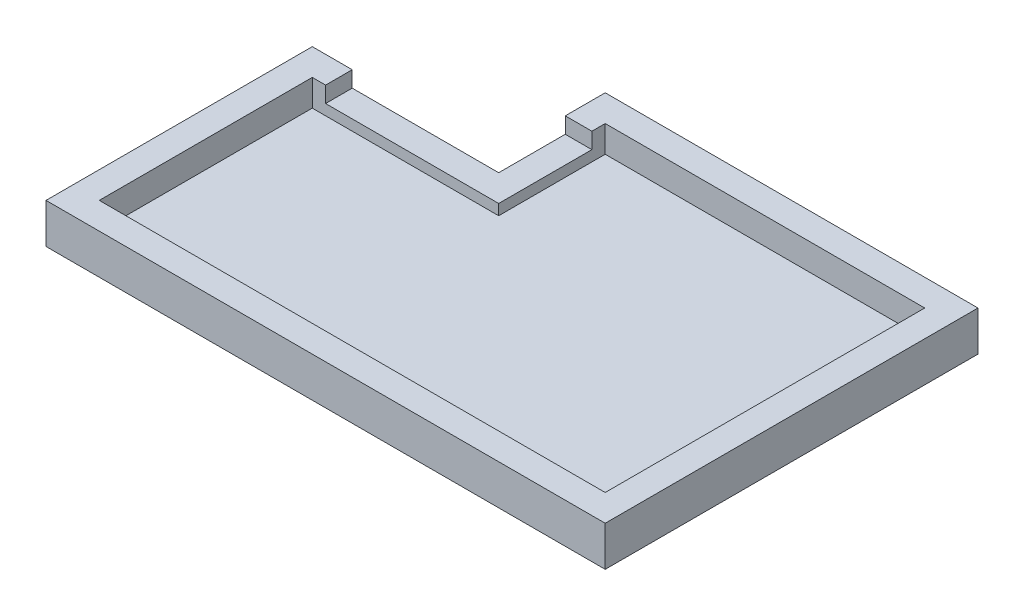
ISO-10303-21;
HEADER;
FILE_DESCRIPTION(('STEP AP214'),'2;1');
FILE_NAME('part.step','',(''),(''),'','','');
FILE_SCHEMA(('AUTOMOTIVE_DESIGN { 1 0 10303 214 1 1 1 1 }'));
ENDSEC;
DATA;
#1=APPLICATION_CONTEXT('core data for automotive mechanical design processes');
#2=APPLICATION_PROTOCOL_DEFINITION('international standard','automotive_design',2000,#1);
#3=PRODUCT_CONTEXT('',#1,'mechanical');
#4=PRODUCT('Part','Part','',(#3));
#5=PRODUCT_RELATED_PRODUCT_CATEGORY('part','',(#4));
#6=PRODUCT_DEFINITION_FORMATION('','',#4);
#7=PRODUCT_DEFINITION_CONTEXT('part definition',#1,'design');
#8=PRODUCT_DEFINITION('design','',#6,#7);
#9=PRODUCT_DEFINITION_SHAPE('','',#8);
#10=(LENGTH_UNIT() NAMED_UNIT(*) SI_UNIT(.MILLI.,.METRE.));
#11=(NAMED_UNIT(*) PLANE_ANGLE_UNIT() SI_UNIT($,.RADIAN.));
#12=(NAMED_UNIT(*) SI_UNIT($,.STERADIAN.) SOLID_ANGLE_UNIT());
#13=UNCERTAINTY_MEASURE_WITH_UNIT(LENGTH_MEASURE(1.E-05),#10,'distance_accuracy_value','');
#14=(GEOMETRIC_REPRESENTATION_CONTEXT(3) GLOBAL_UNCERTAINTY_ASSIGNED_CONTEXT((#13)) GLOBAL_UNIT_ASSIGNED_CONTEXT((#10,
#11,#12)) REPRESENTATION_CONTEXT('',''));
#15=CARTESIAN_POINT('',(0.,0.,0.));
#16=DIRECTION('',(0.,0.,1.));
#17=DIRECTION('',(1.,0.,0.));
#18=AXIS2_PLACEMENT_3D('',#15,#16,#17);
#19=CARTESIAN_POINT('',(266.7,19.05,0.));
#20=DIRECTION('',(0.,0.,-1.));
#21=DIRECTION('',(-1.,0.,0.));
#22=AXIS2_PLACEMENT_3D('',#19,#20,#21);
#23=PLANE('',#22);
#24=DIRECTION('',(1.,0.,0.));
#25=VECTOR('',#24,1.);
#26=CARTESIAN_POINT('',(266.7,0.,0.));
#27=LINE('',#26,#25);
#28=CARTESIAN_POINT('',(0.,0.,0.));
#29=VERTEX_POINT('',#28);
#30=CARTESIAN_POINT('',(266.7,0.,0.));
#31=VERTEX_POINT('',#30);
#32=EDGE_CURVE('E213',#29,#31,#27,.T.);
#33=ORIENTED_EDGE('',*,*,#32,.T.);
#34=DIRECTION('',(0.,-1.,0.));
#35=VECTOR('',#34,1.);
#36=CARTESIAN_POINT('',(266.7,19.05,0.));
#37=LINE('',#36,#35);
#38=CARTESIAN_POINT('',(266.7,19.05,0.));
#39=VERTEX_POINT('',#38);
#40=EDGE_CURVE('E11',#39,#31,#37,.T.);
#41=ORIENTED_EDGE('',*,*,#40,.F.);
#42=DIRECTION('',(1.,0.,0.));
#43=VECTOR('',#42,1.);
#44=CARTESIAN_POINT('',(266.7,19.05,0.));
#45=LINE('',#44,#43);
#46=CARTESIAN_POINT('',(0.,19.05,0.));
#47=VERTEX_POINT('',#46);
#48=EDGE_CURVE('E224',#47,#39,#45,.T.);
#49=ORIENTED_EDGE('',*,*,#48,.F.);
#50=DIRECTION('',(0.,-1.,0.));
#51=VECTOR('',#50,1.);
#52=CARTESIAN_POINT('',(0.,19.05,0.));
#53=LINE('',#52,#51);
#54=EDGE_CURVE('E238',#47,#29,#53,.T.);
#55=ORIENTED_EDGE('',*,*,#54,.T.);
#56=EDGE_LOOP('',(#33,#41,#49,#55));
#57=FACE_BOUND('',#56,.T.);
#58=ADVANCED_FACE('F33',(#57),#23,.F.);
#59=CARTESIAN_POINT('',(266.7,19.05,-177.8));
#60=DIRECTION('',(-1.,0.,0.));
#61=DIRECTION('',(0.,0.,1.));
#62=AXIS2_PLACEMENT_3D('',#59,#60,#61);
#63=PLANE('',#62);
#64=DIRECTION('',(0.,0.,-1.));
#65=VECTOR('',#64,1.);
#66=CARTESIAN_POINT('',(266.7,0.,-177.8));
#67=LINE('',#66,#65);
#68=CARTESIAN_POINT('',(266.7,0.,-177.8));
#69=VERTEX_POINT('',#68);
#70=EDGE_CURVE('E241',#31,#69,#67,.T.);
#71=ORIENTED_EDGE('',*,*,#70,.T.);
#72=DIRECTION('',(0.,-1.,0.));
#73=VECTOR('',#72,1.);
#74=CARTESIAN_POINT('',(266.7,19.05,-177.8));
#75=LINE('',#74,#73);
#76=CARTESIAN_POINT('',(266.7,19.05,-177.8));
#77=VERTEX_POINT('',#76);
#78=EDGE_CURVE('E40',#77,#69,#75,.T.);
#79=ORIENTED_EDGE('',*,*,#78,.F.);
#80=DIRECTION('',(0.,0.,-1.));
#81=VECTOR('',#80,1.);
#82=CARTESIAN_POINT('',(266.7,19.05,-177.8));
#83=LINE('',#82,#81);
#84=EDGE_CURVE('E227',#39,#77,#83,.T.);
#85=ORIENTED_EDGE('',*,*,#84,.F.);
#86=ORIENTED_EDGE('',*,*,#40,.T.);
#87=EDGE_LOOP('',(#71,#79,#85,#86));
#88=FACE_BOUND('',#87,.T.);
#89=ADVANCED_FACE('F284',(#88),#63,.F.);
#90=CARTESIAN_POINT('',(88.9,19.05,-177.8));
#91=DIRECTION('',(0.,0.,1.));
#92=DIRECTION('',(1.,0.,0.));
#93=AXIS2_PLACEMENT_3D('',#90,#91,#92);
#94=PLANE('',#93);
#95=DIRECTION('',(-1.,0.,0.));
#96=VECTOR('',#95,1.);
#97=CARTESIAN_POINT('',(88.9,0.,-177.8));
#98=LINE('',#97,#96);
#99=CARTESIAN_POINT('',(88.9,0.,-177.8));
#100=VERTEX_POINT('',#99);
#101=EDGE_CURVE('E243',#69,#100,#98,.T.);
#102=ORIENTED_EDGE('',*,*,#101,.T.);
#103=DIRECTION('',(0.,-1.,0.));
#104=VECTOR('',#103,1.);
#105=CARTESIAN_POINT('',(88.9,19.05,-177.8));
#106=LINE('',#105,#104);
#107=CARTESIAN_POINT('',(88.9,19.05,-177.8));
#108=VERTEX_POINT('',#107);
#109=EDGE_CURVE('E258',#108,#100,#106,.T.);
#110=ORIENTED_EDGE('',*,*,#109,.F.);
#111=DIRECTION('',(-1.,0.,0.));
#112=VECTOR('',#111,1.);
#113=CARTESIAN_POINT('',(88.9,19.05,-177.8));
#114=LINE('',#113,#112);
#115=EDGE_CURVE('E230',#77,#108,#114,.T.);
#116=ORIENTED_EDGE('',*,*,#115,.F.);
#117=ORIENTED_EDGE('',*,*,#78,.T.);
#118=EDGE_LOOP('',(#102,#110,#116,#117));
#119=FACE_BOUND('',#118,.T.);
#120=ADVANCED_FACE('F265',(#119),#94,.F.);
#121=CARTESIAN_POINT('',(88.9,19.05,-127.));
#122=DIRECTION('',(1.,0.,0.));
#123=DIRECTION('',(0.,0.,-1.));
#124=AXIS2_PLACEMENT_3D('',#121,#122,#123);
#125=PLANE('',#124);
#126=DIRECTION('',(0.,0.,1.));
#127=VECTOR('',#126,1.);
#128=CARTESIAN_POINT('',(88.9,11.43,-158.75));
#129=LINE('',#128,#127);
#130=CARTESIAN_POINT('',(88.9,11.43,-158.75));
#131=VERTEX_POINT('',#130);
#132=CARTESIAN_POINT('',(88.9,11.43,-127.));
#133=VERTEX_POINT('',#132);
#134=EDGE_CURVE('E160',#131,#133,#129,.T.);
#135=ORIENTED_EDGE('',*,*,#134,.F.);
#136=DIRECTION('',(0.,1.,0.));
#137=VECTOR('',#136,1.);
#138=CARTESIAN_POINT('',(88.9,11.43,-158.75));
#139=LINE('',#138,#137);
#140=CARTESIAN_POINT('',(88.9,19.05,-158.75));
#141=VERTEX_POINT('',#140);
#142=EDGE_CURVE('E198',#131,#141,#139,.T.);
#143=ORIENTED_EDGE('',*,*,#142,.T.);
#144=DIRECTION('',(0.,0.,1.));
#145=VECTOR('',#144,1.);
#146=CARTESIAN_POINT('',(88.9,19.05,-127.));
#147=LINE('',#146,#145);
#148=EDGE_CURVE('E232',#108,#141,#147,.T.);
#149=ORIENTED_EDGE('',*,*,#148,.F.);
#150=ORIENTED_EDGE('',*,*,#109,.T.);
#151=DIRECTION('',(0.,0.,1.));
#152=VECTOR('',#151,1.);
#153=CARTESIAN_POINT('',(88.9,0.,-127.));
#154=LINE('',#153,#152);
#155=CARTESIAN_POINT('',(88.9,0.,-127.));
#156=VERTEX_POINT('',#155);
#157=EDGE_CURVE('E245',#100,#156,#154,.T.);
#158=ORIENTED_EDGE('',*,*,#157,.T.);
#159=DIRECTION('',(0.,-1.,0.));
#160=VECTOR('',#159,1.);
#161=CARTESIAN_POINT('',(88.9,19.05,-127.));
#162=LINE('',#161,#160);
#163=EDGE_CURVE('E256',#133,#156,#162,.T.);
#164=ORIENTED_EDGE('',*,*,#163,.F.);
#165=EDGE_LOOP('',(#135,#143,#149,#150,#158,#164));
#166=FACE_BOUND('',#165,.T.);
#167=ADVANCED_FACE('F275',(#166),#125,.F.);
#168=CARTESIAN_POINT('',(0.,19.05,-127.));
#169=DIRECTION('',(0.,0.,1.));
#170=DIRECTION('',(1.,0.,0.));
#171=AXIS2_PLACEMENT_3D('',#168,#169,#170);
#172=PLANE('',#171);
#173=DIRECTION('',(-1.,0.,0.));
#174=VECTOR('',#173,1.);
#175=CARTESIAN_POINT('',(0.,19.05,-127.));
#176=LINE('',#175,#174);
#177=CARTESIAN_POINT('',(19.05,19.05,-127.));
#178=VERTEX_POINT('',#177);
#179=CARTESIAN_POINT('',(0.,19.05,-127.));
#180=VERTEX_POINT('',#179);
#181=EDGE_CURVE('E168',#178,#180,#176,.T.);
#182=ORIENTED_EDGE('',*,*,#181,.F.);
#183=DIRECTION('',(0.,1.,0.));
#184=VECTOR('',#183,1.);
#185=CARTESIAN_POINT('',(19.05,11.43,-127.));
#186=LINE('',#185,#184);
#187=CARTESIAN_POINT('',(19.05,11.43,-127.));
#188=VERTEX_POINT('',#187);
#189=EDGE_CURVE('E150',#188,#178,#186,.T.);
#190=ORIENTED_EDGE('',*,*,#189,.F.);
#191=DIRECTION('',(-1.,0.,0.));
#192=VECTOR('',#191,1.);
#193=CARTESIAN_POINT('',(88.9,11.43,-127.));
#194=LINE('',#193,#192);
#195=EDGE_CURVE('E154',#133,#188,#194,.T.);
#196=ORIENTED_EDGE('',*,*,#195,.F.);
#197=ORIENTED_EDGE('',*,*,#163,.T.);
#198=DIRECTION('',(-1.,0.,0.));
#199=VECTOR('',#198,1.);
#200=CARTESIAN_POINT('',(0.,0.,-127.));
#201=LINE('',#200,#199);
#202=CARTESIAN_POINT('',(0.,0.,-127.));
#203=VERTEX_POINT('',#202);
#204=EDGE_CURVE('E248',#156,#203,#201,.T.);
#205=ORIENTED_EDGE('',*,*,#204,.T.);
#206=DIRECTION('',(0.,-1.,0.));
#207=VECTOR('',#206,1.);
#208=CARTESIAN_POINT('',(0.,19.05,-127.));
#209=LINE('',#208,#207);
#210=EDGE_CURVE('E253',#180,#203,#209,.T.);
#211=ORIENTED_EDGE('',*,*,#210,.F.);
#212=EDGE_LOOP('',(#182,#190,#196,#197,#205,#211));
#213=FACE_BOUND('',#212,.T.);
#214=ADVANCED_FACE('F166',(#213),#172,.F.);
#215=CARTESIAN_POINT('',(0.,19.05,0.));
#216=DIRECTION('',(1.,0.,0.));
#217=DIRECTION('',(0.,0.,-1.));
#218=AXIS2_PLACEMENT_3D('',#215,#216,#217);
#219=PLANE('',#218);
#220=DIRECTION('',(0.,0.,1.));
#221=VECTOR('',#220,1.);
#222=CARTESIAN_POINT('',(0.,0.,0.));
#223=LINE('',#222,#221);
#224=EDGE_CURVE('E228',#203,#29,#223,.T.);
#225=ORIENTED_EDGE('',*,*,#224,.T.);
#226=ORIENTED_EDGE('',*,*,#54,.F.);
#227=DIRECTION('',(0.,0.,1.));
#228=VECTOR('',#227,1.);
#229=CARTESIAN_POINT('',(0.,19.05,0.));
#230=LINE('',#229,#228);
#231=EDGE_CURVE('E236',#180,#47,#230,.T.);
#232=ORIENTED_EDGE('',*,*,#231,.F.);
#233=ORIENTED_EDGE('',*,*,#210,.T.);
#234=EDGE_LOOP('',(#225,#226,#232,#233));
#235=FACE_BOUND('',#234,.T.);
#236=ADVANCED_FACE('F288',(#235),#219,.F.);
#237=CARTESIAN_POINT('',(0.,19.05,0.));
#238=DIRECTION('',(0.,-1.,0.));
#239=DIRECTION('',(0.,0.,-1.));
#240=AXIS2_PLACEMENT_3D('',#237,#238,#239);
#241=PLANE('',#240);
#242=ORIENTED_EDGE('',*,*,#148,.T.);
#243=DIRECTION('',(-1.,0.,0.));
#244=VECTOR('',#243,1.);
#245=CARTESIAN_POINT('',(101.6,19.05,-158.75));
#246=LINE('',#245,#244);
#247=CARTESIAN_POINT('',(101.6,19.05,-158.75));
#248=VERTEX_POINT('',#247);
#249=EDGE_CURVE('E163',#248,#141,#246,.T.);
#250=ORIENTED_EDGE('',*,*,#249,.F.);
#251=DIRECTION('',(0.,0.,1.));
#252=VECTOR('',#251,1.);
#253=CARTESIAN_POINT('',(101.6,19.05,-114.3));
#254=LINE('',#253,#252);
#255=CARTESIAN_POINT('',(101.6,19.05,-165.1));
#256=VERTEX_POINT('',#255);
#257=EDGE_CURVE('E207',#256,#248,#254,.T.);
#258=ORIENTED_EDGE('',*,*,#257,.F.);
#259=DIRECTION('',(-1.,0.,0.));
#260=VECTOR('',#259,1.);
#261=CARTESIAN_POINT('',(101.6,19.05,-165.1));
#262=LINE('',#261,#260);
#263=CARTESIAN_POINT('',(254.,19.05,-165.1));
#264=VERTEX_POINT('',#263);
#265=EDGE_CURVE('E204',#264,#256,#262,.T.);
#266=ORIENTED_EDGE('',*,*,#265,.F.);
#267=DIRECTION('',(0.,0.,-1.));
#268=VECTOR('',#267,1.);
#269=CARTESIAN_POINT('',(254.,19.05,-165.1));
#270=LINE('',#269,#268);
#271=CARTESIAN_POINT('',(254.,19.05,-12.7));
#272=VERTEX_POINT('',#271);
#273=EDGE_CURVE('E201',#272,#264,#270,.T.);
#274=ORIENTED_EDGE('',*,*,#273,.F.);
#275=DIRECTION('',(1.,0.,0.));
#276=VECTOR('',#275,1.);
#277=CARTESIAN_POINT('',(254.,19.05,-12.7));
#278=LINE('',#277,#276);
#279=CARTESIAN_POINT('',(12.7,19.05,-12.7));
#280=VERTEX_POINT('',#279);
#281=EDGE_CURVE('E197',#280,#272,#278,.T.);
#282=ORIENTED_EDGE('',*,*,#281,.F.);
#283=DIRECTION('',(0.,0.,1.));
#284=VECTOR('',#283,1.);
#285=CARTESIAN_POINT('',(12.7,19.05,-12.7));
#286=LINE('',#285,#284);
#287=CARTESIAN_POINT('',(12.7,19.05,-114.3));
#288=VERTEX_POINT('',#287);
#289=EDGE_CURVE('E55',#288,#280,#286,.T.);
#290=ORIENTED_EDGE('',*,*,#289,.F.);
#291=DIRECTION('',(-1.,0.,0.));
#292=VECTOR('',#291,1.);
#293=CARTESIAN_POINT('',(12.7,19.05,-114.3));
#294=LINE('',#293,#292);
#295=CARTESIAN_POINT('',(19.05,19.05,-114.3));
#296=VERTEX_POINT('',#295);
#297=EDGE_CURVE('E180',#296,#288,#294,.T.);
#298=ORIENTED_EDGE('',*,*,#297,.F.);
#299=DIRECTION('',(0.,0.,1.));
#300=VECTOR('',#299,1.);
#301=CARTESIAN_POINT('',(19.05,19.05,-127.));
#302=LINE('',#301,#300);
#303=EDGE_CURVE('E291',#178,#296,#302,.T.);
#304=ORIENTED_EDGE('',*,*,#303,.F.);
#305=ORIENTED_EDGE('',*,*,#181,.T.);
#306=ORIENTED_EDGE('',*,*,#231,.T.);
#307=ORIENTED_EDGE('',*,*,#48,.T.);
#308=ORIENTED_EDGE('',*,*,#84,.T.);
#309=ORIENTED_EDGE('',*,*,#115,.T.);
#310=EDGE_LOOP('',(#242,#250,#258,#266,#274,#282,#290,#298,#304,#305,#306,#307,#308,#309));
#311=FACE_BOUND('',#310,.T.);
#312=ADVANCED_FACE('F280',(#311),#241,.F.);
#313=CARTESIAN_POINT('',(0.,0.,0.));
#314=DIRECTION('',(0.,-1.,0.));
#315=DIRECTION('',(0.,0.,-1.));
#316=AXIS2_PLACEMENT_3D('',#313,#314,#315);
#317=PLANE('',#316);
#318=ORIENTED_EDGE('',*,*,#32,.F.);
#319=ORIENTED_EDGE('',*,*,#224,.F.);
#320=ORIENTED_EDGE('',*,*,#204,.F.);
#321=ORIENTED_EDGE('',*,*,#157,.F.);
#322=ORIENTED_EDGE('',*,*,#101,.F.);
#323=ORIENTED_EDGE('',*,*,#70,.F.);
#324=EDGE_LOOP('',(#318,#319,#320,#321,#322,#323));
#325=FACE_BOUND('',#324,.T.);
#326=ADVANCED_FACE('F271',(#325),#317,.T.);
#327=CARTESIAN_POINT('',(12.7,6.35,-12.7));
#328=DIRECTION('',(-1.,0.,0.));
#329=DIRECTION('',(0.,0.,1.));
#330=AXIS2_PLACEMENT_3D('',#327,#328,#329);
#331=PLANE('',#330);
#332=ORIENTED_EDGE('',*,*,#289,.T.);
#333=DIRECTION('',(0.,1.,0.));
#334=VECTOR('',#333,1.);
#335=CARTESIAN_POINT('',(12.7,6.35,-12.7));
#336=LINE('',#335,#334);
#337=CARTESIAN_POINT('',(12.7,6.35,-12.7));
#338=VERTEX_POINT('',#337);
#339=EDGE_CURVE('E195',#338,#280,#336,.T.);
#340=ORIENTED_EDGE('',*,*,#339,.F.);
#341=DIRECTION('',(0.,0.,1.));
#342=VECTOR('',#341,1.);
#343=CARTESIAN_POINT('',(12.7,6.35,-12.7));
#344=LINE('',#343,#342);
#345=CARTESIAN_POINT('',(12.7,6.35,-114.3));
#346=VERTEX_POINT('',#345);
#347=EDGE_CURVE('E176',#346,#338,#344,.T.);
#348=ORIENTED_EDGE('',*,*,#347,.F.);
#349=DIRECTION('',(0.,1.,0.));
#350=VECTOR('',#349,1.);
#351=CARTESIAN_POINT('',(12.7,6.35,-114.3));
#352=LINE('',#351,#350);
#353=EDGE_CURVE('E211',#346,#288,#352,.T.);
#354=ORIENTED_EDGE('',*,*,#353,.T.);
#355=EDGE_LOOP('',(#332,#340,#348,#354));
#356=FACE_BOUND('',#355,.T.);
#357=ADVANCED_FACE('F316',(#356),#331,.F.);
#358=CARTESIAN_POINT('',(12.7,6.35,-114.3));
#359=DIRECTION('',(0.,0.,-1.));
#360=DIRECTION('',(-1.,0.,0.));
#361=AXIS2_PLACEMENT_3D('',#358,#359,#360);
#362=PLANE('',#361);
#363=DIRECTION('',(1.,0.,0.));
#364=VECTOR('',#363,1.);
#365=CARTESIAN_POINT('',(19.05,11.43,-114.3));
#366=LINE('',#365,#364);
#367=CARTESIAN_POINT('',(19.05,11.43,-114.3));
#368=VERTEX_POINT('',#367);
#369=CARTESIAN_POINT('',(101.6,11.43,-114.3));
#370=VERTEX_POINT('',#369);
#371=EDGE_CURVE('E47',#368,#370,#366,.T.);
#372=ORIENTED_EDGE('',*,*,#371,.F.);
#373=DIRECTION('',(0.,1.,0.));
#374=VECTOR('',#373,1.);
#375=CARTESIAN_POINT('',(19.05,11.43,-114.3));
#376=LINE('',#375,#374);
#377=EDGE_CURVE('E153',#368,#296,#376,.T.);
#378=ORIENTED_EDGE('',*,*,#377,.T.);
#379=ORIENTED_EDGE('',*,*,#297,.T.);
#380=ORIENTED_EDGE('',*,*,#353,.F.);
#381=DIRECTION('',(-1.,0.,0.));
#382=VECTOR('',#381,1.);
#383=CARTESIAN_POINT('',(12.7,6.35,-114.3));
#384=LINE('',#383,#382);
#385=CARTESIAN_POINT('',(101.6,6.35,-114.3));
#386=VERTEX_POINT('',#385);
#387=EDGE_CURVE('E192',#386,#346,#384,.T.);
#388=ORIENTED_EDGE('',*,*,#387,.F.);
#389=DIRECTION('',(0.,1.,0.));
#390=VECTOR('',#389,1.);
#391=CARTESIAN_POINT('',(101.6,6.35,-114.3));
#392=LINE('',#391,#390);
#393=EDGE_CURVE('E214',#386,#370,#392,.T.);
#394=ORIENTED_EDGE('',*,*,#393,.T.);
#395=EDGE_LOOP('',(#372,#378,#379,#380,#388,#394));
#396=FACE_BOUND('',#395,.T.);
#397=ADVANCED_FACE('F321',(#396),#362,.F.);
#398=CARTESIAN_POINT('',(101.6,6.35,-114.3));
#399=DIRECTION('',(-1.,0.,0.));
#400=DIRECTION('',(0.,0.,1.));
#401=AXIS2_PLACEMENT_3D('',#398,#399,#400);
#402=PLANE('',#401);
#403=ORIENTED_EDGE('',*,*,#257,.T.);
#404=DIRECTION('',(0.,1.,0.));
#405=VECTOR('',#404,1.);
#406=CARTESIAN_POINT('',(101.6,11.43,-158.75));
#407=LINE('',#406,#405);
#408=CARTESIAN_POINT('',(101.6,11.43,-158.75));
#409=VERTEX_POINT('',#408);
#410=EDGE_CURVE('E170',#409,#248,#407,.T.);
#411=ORIENTED_EDGE('',*,*,#410,.F.);
#412=DIRECTION('',(0.,0.,-1.));
#413=VECTOR('',#412,1.);
#414=CARTESIAN_POINT('',(101.6,11.43,-114.3));
#415=LINE('',#414,#413);
#416=EDGE_CURVE('E301',#370,#409,#415,.T.);
#417=ORIENTED_EDGE('',*,*,#416,.F.);
#418=ORIENTED_EDGE('',*,*,#393,.F.);
#419=DIRECTION('',(0.,0.,1.));
#420=VECTOR('',#419,1.);
#421=CARTESIAN_POINT('',(101.6,6.35,-114.3));
#422=LINE('',#421,#420);
#423=CARTESIAN_POINT('',(101.6,6.35,-165.1));
#424=VERTEX_POINT('',#423);
#425=EDGE_CURVE('E189',#424,#386,#422,.T.);
#426=ORIENTED_EDGE('',*,*,#425,.F.);
#427=DIRECTION('',(0.,1.,0.));
#428=VECTOR('',#427,1.);
#429=CARTESIAN_POINT('',(101.6,6.35,-165.1));
#430=LINE('',#429,#428);
#431=EDGE_CURVE('E217',#424,#256,#430,.T.);
#432=ORIENTED_EDGE('',*,*,#431,.T.);
#433=EDGE_LOOP('',(#403,#411,#417,#418,#426,#432));
#434=FACE_BOUND('',#433,.T.);
#435=ADVANCED_FACE('F300',(#434),#402,.F.);
#436=CARTESIAN_POINT('',(101.6,6.35,-165.1));
#437=DIRECTION('',(0.,0.,-1.));
#438=DIRECTION('',(-1.,0.,0.));
#439=AXIS2_PLACEMENT_3D('',#436,#437,#438);
#440=PLANE('',#439);
#441=ORIENTED_EDGE('',*,*,#265,.T.);
#442=ORIENTED_EDGE('',*,*,#431,.F.);
#443=DIRECTION('',(-1.,0.,0.));
#444=VECTOR('',#443,1.);
#445=CARTESIAN_POINT('',(101.6,6.35,-165.1));
#446=LINE('',#445,#444);
#447=CARTESIAN_POINT('',(254.,6.35,-165.1));
#448=VERTEX_POINT('',#447);
#449=EDGE_CURVE('E186',#448,#424,#446,.T.);
#450=ORIENTED_EDGE('',*,*,#449,.F.);
#451=DIRECTION('',(0.,1.,0.));
#452=VECTOR('',#451,1.);
#453=CARTESIAN_POINT('',(254.,6.35,-165.1));
#454=LINE('',#453,#452);
#455=EDGE_CURVE('E219',#448,#264,#454,.T.);
#456=ORIENTED_EDGE('',*,*,#455,.T.);
#457=EDGE_LOOP('',(#441,#442,#450,#456));
#458=FACE_BOUND('',#457,.T.);
#459=ADVANCED_FACE('F307',(#458),#440,.F.);
#460=CARTESIAN_POINT('',(254.,6.35,-165.1));
#461=DIRECTION('',(1.,0.,0.));
#462=DIRECTION('',(0.,0.,-1.));
#463=AXIS2_PLACEMENT_3D('',#460,#461,#462);
#464=PLANE('',#463);
#465=ORIENTED_EDGE('',*,*,#273,.T.);
#466=ORIENTED_EDGE('',*,*,#455,.F.);
#467=DIRECTION('',(0.,0.,-1.));
#468=VECTOR('',#467,1.);
#469=CARTESIAN_POINT('',(254.,6.35,-165.1));
#470=LINE('',#469,#468);
#471=CARTESIAN_POINT('',(254.,6.35,-12.7));
#472=VERTEX_POINT('',#471);
#473=EDGE_CURVE('E183',#472,#448,#470,.T.);
#474=ORIENTED_EDGE('',*,*,#473,.F.);
#475=DIRECTION('',(0.,1.,0.));
#476=VECTOR('',#475,1.);
#477=CARTESIAN_POINT('',(254.,6.35,-12.7));
#478=LINE('',#477,#476);
#479=EDGE_CURVE('E221',#472,#272,#478,.T.);
#480=ORIENTED_EDGE('',*,*,#479,.T.);
#481=EDGE_LOOP('',(#465,#466,#474,#480));
#482=FACE_BOUND('',#481,.T.);
#483=ADVANCED_FACE('F311',(#482),#464,.F.);
#484=CARTESIAN_POINT('',(254.,6.35,-12.7));
#485=DIRECTION('',(0.,0.,1.));
#486=DIRECTION('',(1.,0.,0.));
#487=AXIS2_PLACEMENT_3D('',#484,#485,#486);
#488=PLANE('',#487);
#489=ORIENTED_EDGE('',*,*,#281,.T.);
#490=ORIENTED_EDGE('',*,*,#479,.F.);
#491=DIRECTION('',(1.,0.,0.));
#492=VECTOR('',#491,1.);
#493=CARTESIAN_POINT('',(254.,6.35,-12.7));
#494=LINE('',#493,#492);
#495=EDGE_CURVE('E179',#338,#472,#494,.T.);
#496=ORIENTED_EDGE('',*,*,#495,.F.);
#497=ORIENTED_EDGE('',*,*,#339,.T.);
#498=EDGE_LOOP('',(#489,#490,#496,#497));
#499=FACE_BOUND('',#498,.T.);
#500=ADVANCED_FACE('F314',(#499),#488,.F.);
#501=CARTESIAN_POINT('',(0.,6.35,0.));
#502=DIRECTION('',(0.,-1.,0.));
#503=DIRECTION('',(0.,0.,-1.));
#504=AXIS2_PLACEMENT_3D('',#501,#502,#503);
#505=PLANE('',#504);
#506=ORIENTED_EDGE('',*,*,#347,.T.);
#507=ORIENTED_EDGE('',*,*,#495,.T.);
#508=ORIENTED_EDGE('',*,*,#473,.T.);
#509=ORIENTED_EDGE('',*,*,#449,.T.);
#510=ORIENTED_EDGE('',*,*,#425,.T.);
#511=ORIENTED_EDGE('',*,*,#387,.T.);
#512=EDGE_LOOP('',(#506,#507,#508,#509,#510,#511));
#513=FACE_BOUND('',#512,.T.);
#514=ADVANCED_FACE('F319',(#513),#505,.F.);
#515=CARTESIAN_POINT('',(101.6,11.43,-158.75));
#516=DIRECTION('',(0.,0.,-1.));
#517=DIRECTION('',(-1.,0.,0.));
#518=AXIS2_PLACEMENT_3D('',#515,#516,#517);
#519=PLANE('',#518);
#520=ORIENTED_EDGE('',*,*,#249,.T.);
#521=ORIENTED_EDGE('',*,*,#142,.F.);
#522=DIRECTION('',(-1.,0.,0.));
#523=VECTOR('',#522,1.);
#524=CARTESIAN_POINT('',(101.6,11.43,-158.75));
#525=LINE('',#524,#523);
#526=EDGE_CURVE('E172',#409,#131,#525,.T.);
#527=ORIENTED_EDGE('',*,*,#526,.F.);
#528=ORIENTED_EDGE('',*,*,#410,.T.);
#529=EDGE_LOOP('',(#520,#521,#527,#528));
#530=FACE_BOUND('',#529,.T.);
#531=ADVANCED_FACE('F298',(#530),#519,.F.);
#532=CARTESIAN_POINT('',(19.05,11.43,-127.));
#533=DIRECTION('',(-1.,0.,0.));
#534=DIRECTION('',(0.,0.,1.));
#535=AXIS2_PLACEMENT_3D('',#532,#533,#534);
#536=PLANE('',#535);
#537=ORIENTED_EDGE('',*,*,#303,.T.);
#538=ORIENTED_EDGE('',*,*,#377,.F.);
#539=DIRECTION('',(0.,0.,1.));
#540=VECTOR('',#539,1.);
#541=CARTESIAN_POINT('',(19.05,11.43,-127.));
#542=LINE('',#541,#540);
#543=EDGE_CURVE('E146',#188,#368,#542,.T.);
#544=ORIENTED_EDGE('',*,*,#543,.F.);
#545=ORIENTED_EDGE('',*,*,#189,.T.);
#546=EDGE_LOOP('',(#537,#538,#544,#545));
#547=FACE_BOUND('',#546,.T.);
#548=ADVANCED_FACE('F148',(#547),#536,.F.);
#549=CARTESIAN_POINT('',(0.,11.43,0.));
#550=DIRECTION('',(0.,1.,0.));
#551=DIRECTION('',(0.,0.,1.));
#552=AXIS2_PLACEMENT_3D('',#549,#550,#551);
#553=PLANE('',#552);
#554=ORIENTED_EDGE('',*,*,#195,.T.);
#555=ORIENTED_EDGE('',*,*,#543,.T.);
#556=ORIENTED_EDGE('',*,*,#371,.T.);
#557=ORIENTED_EDGE('',*,*,#416,.T.);
#558=ORIENTED_EDGE('',*,*,#526,.T.);
#559=ORIENTED_EDGE('',*,*,#134,.T.);
#560=EDGE_LOOP('',(#554,#555,#556,#557,#558,#559));
#561=FACE_BOUND('',#560,.T.);
#562=ADVANCED_FACE('F157',(#561),#553,.T.);
#563=CLOSED_SHELL('',(#58,#89,#120,#167,#214,#236,#312,#326,#357,#397,#435,#459,#483,#500,#514,
#531,#548,#562));
#564=MANIFOLD_SOLID_BREP('B2',#563);
#565=ADVANCED_BREP_SHAPE_REPRESENTATION('',(#18,#564),#14);
#566=SHAPE_DEFINITION_REPRESENTATION(#9,#565);
ENDSEC;
END-ISO-10303-21;
